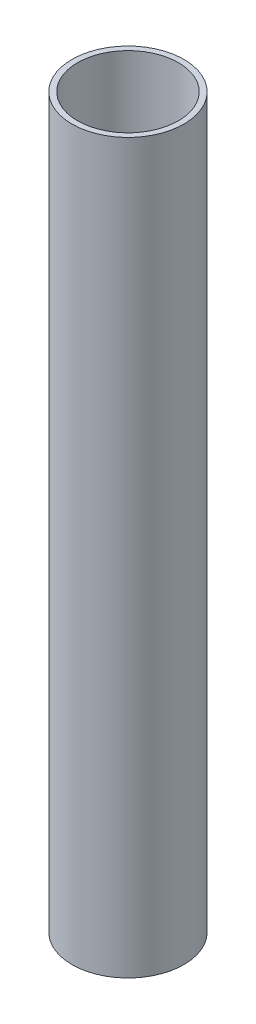
ISO-10303-21;
HEADER;
FILE_DESCRIPTION(('STEP AP214'),'2;1');
FILE_NAME('part.step','',(''),(''),'','','');
FILE_SCHEMA(('AUTOMOTIVE_DESIGN { 1 0 10303 214 1 1 1 1 }'));
ENDSEC;
DATA;
#1=APPLICATION_CONTEXT('core data for automotive mechanical design processes');
#2=APPLICATION_PROTOCOL_DEFINITION('international standard','automotive_design',2000,#1);
#3=PRODUCT_CONTEXT('',#1,'mechanical');
#4=PRODUCT('Part','Part','',(#3));
#5=PRODUCT_RELATED_PRODUCT_CATEGORY('part','',(#4));
#6=PRODUCT_DEFINITION_FORMATION('','',#4);
#7=PRODUCT_DEFINITION_CONTEXT('part definition',#1,'design');
#8=PRODUCT_DEFINITION('design','',#6,#7);
#9=PRODUCT_DEFINITION_SHAPE('','',#8);
#10=(LENGTH_UNIT() NAMED_UNIT(*) SI_UNIT(.MILLI.,.METRE.));
#11=(NAMED_UNIT(*) PLANE_ANGLE_UNIT() SI_UNIT($,.RADIAN.));
#12=(NAMED_UNIT(*) SI_UNIT($,.STERADIAN.) SOLID_ANGLE_UNIT());
#13=UNCERTAINTY_MEASURE_WITH_UNIT(LENGTH_MEASURE(1.E-05),#10,'distance_accuracy_value','');
#14=(GEOMETRIC_REPRESENTATION_CONTEXT(3) GLOBAL_UNCERTAINTY_ASSIGNED_CONTEXT((#13)) GLOBAL_UNIT_ASSIGNED_CONTEXT((#10,
#11,#12)) REPRESENTATION_CONTEXT('',''));
#15=CARTESIAN_POINT('',(0.,0.,0.));
#16=DIRECTION('',(0.,0.,1.));
#17=DIRECTION('',(1.,0.,0.));
#18=AXIS2_PLACEMENT_3D('',#15,#16,#17);
#19=CARTESIAN_POINT('',(0.,130.,0.));
#20=DIRECTION('',(0.,1.,0.));
#21=DIRECTION('',(0.,0.,1.));
#22=AXIS2_PLACEMENT_3D('',#19,#20,#21);
#23=PLANE('',#22);
#24=CARTESIAN_POINT('',(0.,130.,0.));
#25=DIRECTION('',(0.,1.,0.));
#26=DIRECTION('',(0.,0.,1.));
#27=AXIS2_PLACEMENT_3D('',#24,#25,#26);
#28=CIRCLE('',#27,10.);
#29=CARTESIAN_POINT('',(0.,130.,10.));
#30=VERTEX_POINT('',#29);
#31=EDGE_CURVE('E10',#30,#30,#28,.T.);
#32=ORIENTED_EDGE('',*,*,#31,.T.);
#33=EDGE_LOOP('',(#32));
#34=FACE_BOUND('',#33,.T.);
#35=CARTESIAN_POINT('',(0.,130.,0.));
#36=DIRECTION('',(0.,1.,0.));
#37=DIRECTION('',(0.,0.,1.));
#38=AXIS2_PLACEMENT_3D('',#35,#36,#37);
#39=CIRCLE('',#38,9.);
#40=CARTESIAN_POINT('',(0.,130.,9.));
#41=VERTEX_POINT('',#40);
#42=EDGE_CURVE('E44',#41,#41,#39,.T.);
#43=ORIENTED_EDGE('',*,*,#42,.F.);
#44=EDGE_LOOP('',(#43));
#45=FACE_BOUND('',#44,.T.);
#46=ADVANCED_FACE('F33',(#34,#45),#23,.T.);
#47=CARTESIAN_POINT('',(0.,0.,0.));
#48=DIRECTION('',(0.,1.,0.));
#49=DIRECTION('',(0.,0.,1.));
#50=AXIS2_PLACEMENT_3D('',#47,#48,#49);
#51=PLANE('',#50);
#52=CARTESIAN_POINT('',(0.,0.,0.));
#53=DIRECTION('',(0.,1.,0.));
#54=DIRECTION('',(0.,0.,1.));
#55=AXIS2_PLACEMENT_3D('',#52,#53,#54);
#56=CIRCLE('',#55,10.);
#57=CARTESIAN_POINT('',(0.,0.,10.));
#58=VERTEX_POINT('',#57);
#59=EDGE_CURVE('E37',#58,#58,#56,.T.);
#60=ORIENTED_EDGE('',*,*,#59,.F.);
#61=EDGE_LOOP('',(#60));
#62=FACE_BOUND('',#61,.T.);
#63=CARTESIAN_POINT('',(0.,0.,0.));
#64=DIRECTION('',(0.,1.,0.));
#65=DIRECTION('',(0.,0.,1.));
#66=AXIS2_PLACEMENT_3D('',#63,#64,#65);
#67=CIRCLE('',#66,9.);
#68=CARTESIAN_POINT('',(0.,0.,9.));
#69=VERTEX_POINT('',#68);
#70=EDGE_CURVE('E46',#69,#69,#67,.T.);
#71=ORIENTED_EDGE('',*,*,#70,.T.);
#72=EDGE_LOOP('',(#71));
#73=FACE_BOUND('',#72,.T.);
#74=ADVANCED_FACE('F56',(#62,#73),#51,.F.);
#75=CARTESIAN_POINT('',(0.,130.,0.));
#76=DIRECTION('',(0.,-1.,0.));
#77=DIRECTION('',(0.,0.,-1.));
#78=AXIS2_PLACEMENT_3D('',#75,#76,#77);
#79=CYLINDRICAL_SURFACE('',#78,10.);
#80=ORIENTED_EDGE('',*,*,#31,.F.);
#81=EDGE_LOOP('',(#80));
#82=FACE_BOUND('',#81,.T.);
#83=ORIENTED_EDGE('',*,*,#59,.T.);
#84=EDGE_LOOP('',(#83));
#85=FACE_BOUND('',#84,.T.);
#86=ADVANCED_FACE('F35',(#82,#85),#79,.T.);
#87=CARTESIAN_POINT('',(0.,130.,0.));
#88=DIRECTION('',(0.,-1.,0.));
#89=DIRECTION('',(0.,0.,-1.));
#90=AXIS2_PLACEMENT_3D('',#87,#88,#89);
#91=CYLINDRICAL_SURFACE('',#90,9.);
#92=ORIENTED_EDGE('',*,*,#42,.T.);
#93=EDGE_LOOP('',(#92));
#94=FACE_BOUND('',#93,.T.);
#95=ORIENTED_EDGE('',*,*,#70,.F.);
#96=EDGE_LOOP('',(#95));
#97=FACE_BOUND('',#96,.T.);
#98=ADVANCED_FACE('F52',(#94,#97),#91,.F.);
#99=CLOSED_SHELL('',(#46,#74,#86,#98));
#100=MANIFOLD_SOLID_BREP('B2',#99);
#101=ADVANCED_BREP_SHAPE_REPRESENTATION('',(#18,#100),#14);
#102=SHAPE_DEFINITION_REPRESENTATION(#9,#101);
ENDSEC;
END-ISO-10303-21;
